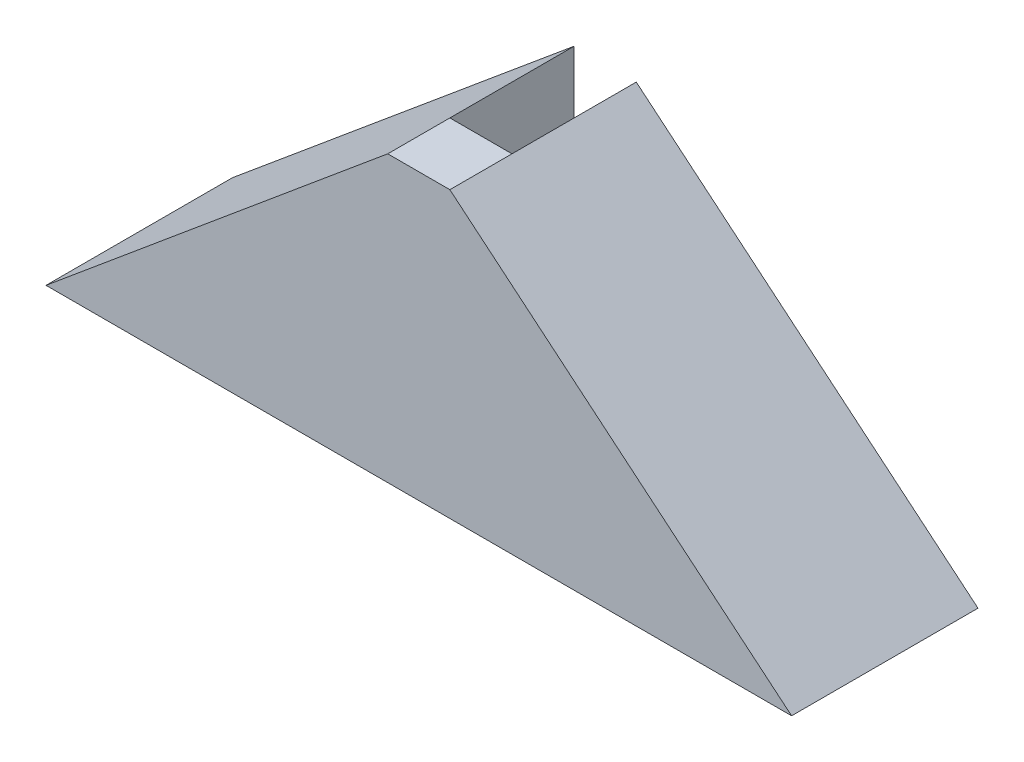
ISO-10303-21;
HEADER;
FILE_DESCRIPTION(('STEP AP214'),'2;1');
FILE_NAME('part.step','',(''),(''),'','','');
FILE_SCHEMA(('AUTOMOTIVE_DESIGN { 1 0 10303 214 1 1 1 1 }'));
ENDSEC;
DATA;
#1=APPLICATION_CONTEXT('core data for automotive mechanical design processes');
#2=APPLICATION_PROTOCOL_DEFINITION('international standard','automotive_design',2000,#1);
#3=PRODUCT_CONTEXT('',#1,'mechanical');
#4=PRODUCT('Part','Part','',(#3));
#5=PRODUCT_RELATED_PRODUCT_CATEGORY('part','',(#4));
#6=PRODUCT_DEFINITION_FORMATION('','',#4);
#7=PRODUCT_DEFINITION_CONTEXT('part definition',#1,'design');
#8=PRODUCT_DEFINITION('design','',#6,#7);
#9=PRODUCT_DEFINITION_SHAPE('','',#8);
#10=(LENGTH_UNIT() NAMED_UNIT(*) SI_UNIT(.MILLI.,.METRE.));
#11=(NAMED_UNIT(*) PLANE_ANGLE_UNIT() SI_UNIT($,.RADIAN.));
#12=(NAMED_UNIT(*) SI_UNIT($,.STERADIAN.) SOLID_ANGLE_UNIT());
#13=UNCERTAINTY_MEASURE_WITH_UNIT(LENGTH_MEASURE(1.E-05),#10,'distance_accuracy_value','');
#14=(GEOMETRIC_REPRESENTATION_CONTEXT(3) GLOBAL_UNCERTAINTY_ASSIGNED_CONTEXT((#13)) GLOBAL_UNIT_ASSIGNED_CONTEXT((#10,
#11,#12)) REPRESENTATION_CONTEXT('',''));
#15=CARTESIAN_POINT('',(0.,0.,0.));
#16=DIRECTION('',(0.,0.,1.));
#17=DIRECTION('',(1.,0.,0.));
#18=AXIS2_PLACEMENT_3D('',#15,#16,#17);
#19=CARTESIAN_POINT('',(0.,0.,0.));
#20=DIRECTION('',(0.,0.,1.));
#21=DIRECTION('',(1.,0.,0.));
#22=AXIS2_PLACEMENT_3D('',#19,#20,#21);
#23=PLANE('',#22);
#24=DIRECTION('',(-0.768221279597376,-0.64018439966448,0.));
#25=VECTOR('',#24,1.);
#26=CARTESIAN_POINT('',(-15.24,12.7,0.));
#27=LINE('',#26,#25);
#28=CARTESIAN_POINT('',(-16.51,11.6416666666667,0.));
#29=VERTEX_POINT('',#28);
#30=CARTESIAN_POINT('',(-30.48,0.,0.));
#31=VERTEX_POINT('',#30);
#32=EDGE_CURVE('E90',#29,#31,#27,.T.);
#33=ORIENTED_EDGE('',*,*,#32,.F.);
#34=DIRECTION('',(0.,1.,0.));
#35=VECTOR('',#34,1.);
#36=CARTESIAN_POINT('',(-16.51,0.,0.));
#37=LINE('',#36,#35);
#38=CARTESIAN_POINT('',(-16.51,0.,0.));
#39=VERTEX_POINT('',#38);
#40=EDGE_CURVE('E125',#39,#29,#37,.T.);
#41=ORIENTED_EDGE('',*,*,#40,.F.);
#42=DIRECTION('',(-1.,0.,0.));
#43=VECTOR('',#42,1.);
#44=CARTESIAN_POINT('',(0.,0.,0.));
#45=LINE('',#44,#43);
#46=EDGE_CURVE('E100',#39,#31,#45,.T.);
#47=ORIENTED_EDGE('',*,*,#46,.T.);
#48=EDGE_LOOP('',(#33,#41,#47));
#49=FACE_BOUND('',#48,.T.);
#50=ADVANCED_FACE('F39',(#49),#23,.F.);
#51=CARTESIAN_POINT('',(0.,0.,7.62));
#52=DIRECTION('',(-0.64018439966448,-0.768221279597376,0.));
#53=DIRECTION('',(0.768221279597376,-0.64018439966448,0.));
#54=AXIS2_PLACEMENT_3D('',#51,#52,#53);
#55=PLANE('',#54);
#56=DIRECTION('',(0.,0.,1.));
#57=VECTOR('',#56,1.);
#58=CARTESIAN_POINT('',(-13.97,11.6416666666667,7.62));
#59=LINE('',#58,#57);
#60=CARTESIAN_POINT('',(-13.97,11.6416666666667,0.));
#61=VERTEX_POINT('',#60);
#62=CARTESIAN_POINT('',(-13.97,11.6416666666667,5.08));
#63=VERTEX_POINT('',#62);
#64=EDGE_CURVE('E55',#61,#63,#59,.T.);
#65=ORIENTED_EDGE('',*,*,#64,.T.);
#66=DIRECTION('',(0.,0.,-1.));
#67=VECTOR('',#66,1.);
#68=CARTESIAN_POINT('',(-13.97,11.6416666666667,7.62));
#69=LINE('',#68,#67);
#70=CARTESIAN_POINT('',(-13.97,11.6416666666667,7.62));
#71=VERTEX_POINT('',#70);
#72=EDGE_CURVE('E170',#71,#63,#69,.T.);
#73=ORIENTED_EDGE('',*,*,#72,.F.);
#74=DIRECTION('',(-0.768221279597376,0.64018439966448,0.));
#75=VECTOR('',#74,1.);
#76=CARTESIAN_POINT('',(0.,0.,7.62));
#77=LINE('',#76,#75);
#78=CARTESIAN_POINT('',(0.,0.,7.62));
#79=VERTEX_POINT('',#78);
#80=EDGE_CURVE('E79',#79,#71,#77,.T.);
#81=ORIENTED_EDGE('',*,*,#80,.F.);
#82=DIRECTION('',(0.,0.,-1.));
#83=VECTOR('',#82,1.);
#84=CARTESIAN_POINT('',(0.,0.,7.62));
#85=LINE('',#84,#83);
#86=CARTESIAN_POINT('',(0.,0.,0.));
#87=VERTEX_POINT('',#86);
#88=EDGE_CURVE('E63',#79,#87,#85,.T.);
#89=ORIENTED_EDGE('',*,*,#88,.T.);
#90=DIRECTION('',(-0.768221279597376,0.64018439966448,0.));
#91=VECTOR('',#90,1.);
#92=CARTESIAN_POINT('',(0.,0.,0.));
#93=LINE('',#92,#91);
#94=EDGE_CURVE('E76',#87,#61,#93,.T.);
#95=ORIENTED_EDGE('',*,*,#94,.T.);
#96=EDGE_LOOP('',(#65,#73,#81,#89,#95));
#97=FACE_BOUND('',#96,.T.);
#98=ADVANCED_FACE('F41',(#97),#55,.F.);
#99=CARTESIAN_POINT('',(-15.24,12.7,7.62));
#100=DIRECTION('',(0.64018439966448,-0.768221279597376,0.));
#101=DIRECTION('',(0.768221279597376,0.64018439966448,0.));
#102=AXIS2_PLACEMENT_3D('',#99,#100,#101);
#103=PLANE('',#102);
#104=DIRECTION('',(-0.768221279597376,-0.64018439966448,0.));
#105=VECTOR('',#104,1.);
#106=CARTESIAN_POINT('',(-15.24,12.7,7.62));
#107=LINE('',#106,#105);
#108=CARTESIAN_POINT('',(-16.51,11.6416666666667,7.62));
#109=VERTEX_POINT('',#108);
#110=CARTESIAN_POINT('',(-30.48,0.,7.62));
#111=VERTEX_POINT('',#110);
#112=EDGE_CURVE('E104',#109,#111,#107,.T.);
#113=ORIENTED_EDGE('',*,*,#112,.F.);
#114=DIRECTION('',(0.,0.,-1.));
#115=VECTOR('',#114,1.);
#116=CARTESIAN_POINT('',(-16.51,11.6416666666667,7.62));
#117=LINE('',#116,#115);
#118=CARTESIAN_POINT('',(-16.51,11.6416666666667,5.08));
#119=VERTEX_POINT('',#118);
#120=EDGE_CURVE('E140',#109,#119,#117,.T.);
#121=ORIENTED_EDGE('',*,*,#120,.T.);
#122=DIRECTION('',(0.,0.,-1.));
#123=VECTOR('',#122,1.);
#124=CARTESIAN_POINT('',(-16.51,11.6416666666667,7.62));
#125=LINE('',#124,#123);
#126=EDGE_CURVE('E91',#119,#29,#125,.T.);
#127=ORIENTED_EDGE('',*,*,#126,.T.);
#128=ORIENTED_EDGE('',*,*,#32,.T.);
#129=DIRECTION('',(0.,0.,-1.));
#130=VECTOR('',#129,1.);
#131=CARTESIAN_POINT('',(-30.48,0.,7.62));
#132=LINE('',#131,#130);
#133=EDGE_CURVE('E48',#111,#31,#132,.T.);
#134=ORIENTED_EDGE('',*,*,#133,.F.);
#135=EDGE_LOOP('',(#113,#121,#127,#128,#134));
#136=FACE_BOUND('',#135,.T.);
#137=ADVANCED_FACE('F115',(#136),#103,.F.);
#138=CARTESIAN_POINT('',(0.,0.,7.62));
#139=DIRECTION('',(0.,-1.,0.));
#140=DIRECTION('',(1.,0.,0.));
#141=AXIS2_PLACEMENT_3D('',#138,#139,#140);
#142=PLANE('',#141);
#143=DIRECTION('',(0.,0.,-1.));
#144=VECTOR('',#143,1.);
#145=CARTESIAN_POINT('',(-16.51,0.,5.08));
#146=LINE('',#145,#144);
#147=CARTESIAN_POINT('',(-16.51,0.,5.08));
#148=VERTEX_POINT('',#147);
#149=EDGE_CURVE('E146',#148,#39,#146,.T.);
#150=ORIENTED_EDGE('',*,*,#149,.F.);
#151=DIRECTION('',(-1.,0.,0.));
#152=VECTOR('',#151,1.);
#153=CARTESIAN_POINT('',(-16.51,0.,5.08));
#154=LINE('',#153,#152);
#155=CARTESIAN_POINT('',(-13.97,0.,5.08));
#156=VERTEX_POINT('',#155);
#157=EDGE_CURVE('E144',#156,#148,#154,.T.);
#158=ORIENTED_EDGE('',*,*,#157,.F.);
#159=DIRECTION('',(0.,0.,-1.));
#160=VECTOR('',#159,1.);
#161=CARTESIAN_POINT('',(-13.97,0.,5.08));
#162=LINE('',#161,#160);
#163=CARTESIAN_POINT('',(-13.97,0.,0.));
#164=VERTEX_POINT('',#163);
#165=EDGE_CURVE('E98',#156,#164,#162,.T.);
#166=ORIENTED_EDGE('',*,*,#165,.T.);
#167=EDGE_CURVE('E88',#87,#164,#45,.T.);
#168=ORIENTED_EDGE('',*,*,#167,.F.);
#169=ORIENTED_EDGE('',*,*,#88,.F.);
#170=DIRECTION('',(-1.,0.,0.));
#171=VECTOR('',#170,1.);
#172=CARTESIAN_POINT('',(0.,0.,7.62));
#173=LINE('',#172,#171);
#174=EDGE_CURVE('E82',#79,#111,#173,.T.);
#175=ORIENTED_EDGE('',*,*,#174,.T.);
#176=ORIENTED_EDGE('',*,*,#133,.T.);
#177=ORIENTED_EDGE('',*,*,#46,.F.);
#178=EDGE_LOOP('',(#150,#158,#166,#168,#169,#175,#176,#177));
#179=FACE_BOUND('',#178,.T.);
#180=ADVANCED_FACE('F95',(#179),#142,.T.);
#181=CARTESIAN_POINT('',(0.,0.,7.62));
#182=DIRECTION('',(0.,0.,1.));
#183=DIRECTION('',(1.,0.,0.));
#184=AXIS2_PLACEMENT_3D('',#181,#182,#183);
#185=PLANE('',#184);
#186=DIRECTION('',(-1.,0.,0.));
#187=VECTOR('',#186,1.);
#188=CARTESIAN_POINT('',(-13.97,11.6416666666667,7.62));
#189=LINE('',#188,#187);
#190=EDGE_CURVE('E162',#71,#109,#189,.T.);
#191=ORIENTED_EDGE('',*,*,#190,.T.);
#192=ORIENTED_EDGE('',*,*,#112,.T.);
#193=ORIENTED_EDGE('',*,*,#174,.F.);
#194=ORIENTED_EDGE('',*,*,#80,.T.);
#195=EDGE_LOOP('',(#191,#192,#193,#194));
#196=FACE_BOUND('',#195,.T.);
#197=ADVANCED_FACE('F160',(#196),#185,.T.);
#198=ORIENTED_EDGE('',*,*,#167,.T.);
#199=DIRECTION('',(0.,1.,0.));
#200=VECTOR('',#199,1.);
#201=CARTESIAN_POINT('',(-13.97,0.,0.));
#202=LINE('',#201,#200);
#203=EDGE_CURVE('E11',#164,#61,#202,.T.);
#204=ORIENTED_EDGE('',*,*,#203,.T.);
#205=ORIENTED_EDGE('',*,*,#94,.F.);
#206=EDGE_LOOP('',(#198,#204,#205));
#207=FACE_BOUND('',#206,.T.);
#208=ADVANCED_FACE('F86',(#207),#23,.F.);
#209=CARTESIAN_POINT('',(0.,0.,5.08));
#210=DIRECTION('',(0.,0.,-1.));
#211=DIRECTION('',(-1.,0.,0.));
#212=AXIS2_PLACEMENT_3D('',#209,#210,#211);
#213=PLANE('',#212);
#214=DIRECTION('',(-1.,0.,0.));
#215=VECTOR('',#214,1.);
#216=CARTESIAN_POINT('',(0.,11.6416666666667,5.08));
#217=LINE('',#216,#215);
#218=EDGE_CURVE('E132',#63,#119,#217,.T.);
#219=ORIENTED_EDGE('',*,*,#218,.F.);
#220=DIRECTION('',(0.,-1.,0.));
#221=VECTOR('',#220,1.);
#222=CARTESIAN_POINT('',(-13.97,0.,5.08));
#223=LINE('',#222,#221);
#224=EDGE_CURVE('E137',#63,#156,#223,.T.);
#225=ORIENTED_EDGE('',*,*,#224,.T.);
#226=ORIENTED_EDGE('',*,*,#157,.T.);
#227=DIRECTION('',(0.,1.,0.));
#228=VECTOR('',#227,1.);
#229=CARTESIAN_POINT('',(-16.51,0.,5.08));
#230=LINE('',#229,#228);
#231=EDGE_CURVE('E131',#148,#119,#230,.T.);
#232=ORIENTED_EDGE('',*,*,#231,.T.);
#233=EDGE_LOOP('',(#219,#225,#226,#232));
#234=FACE_BOUND('',#233,.T.);
#235=ADVANCED_FACE('F183',(#234),#213,.T.);
#236=CARTESIAN_POINT('',(-16.51,0.,5.08));
#237=DIRECTION('',(-1.,0.,0.));
#238=DIRECTION('',(0.,-1.,0.));
#239=AXIS2_PLACEMENT_3D('',#236,#237,#238);
#240=PLANE('',#239);
#241=ORIENTED_EDGE('',*,*,#231,.F.);
#242=ORIENTED_EDGE('',*,*,#149,.T.);
#243=ORIENTED_EDGE('',*,*,#40,.T.);
#244=ORIENTED_EDGE('',*,*,#126,.F.);
#245=EDGE_LOOP('',(#241,#242,#243,#244));
#246=FACE_BOUND('',#245,.T.);
#247=ADVANCED_FACE('F187',(#246),#240,.F.);
#248=CARTESIAN_POINT('',(-13.97,0.,5.08));
#249=DIRECTION('',(1.,0.,0.));
#250=DIRECTION('',(0.,0.,-1.));
#251=AXIS2_PLACEMENT_3D('',#248,#249,#250);
#252=PLANE('',#251);
#253=ORIENTED_EDGE('',*,*,#203,.F.);
#254=ORIENTED_EDGE('',*,*,#165,.F.);
#255=ORIENTED_EDGE('',*,*,#224,.F.);
#256=ORIENTED_EDGE('',*,*,#64,.F.);
#257=EDGE_LOOP('',(#253,#254,#255,#256));
#258=FACE_BOUND('',#257,.T.);
#259=ADVANCED_FACE('F194',(#258),#252,.F.);
#260=CARTESIAN_POINT('',(-13.97,11.6416666666667,7.62));
#261=DIRECTION('',(0.,-1.,0.));
#262=DIRECTION('',(0.,0.,-1.));
#263=AXIS2_PLACEMENT_3D('',#260,#261,#262);
#264=PLANE('',#263);
#265=ORIENTED_EDGE('',*,*,#218,.T.);
#266=ORIENTED_EDGE('',*,*,#120,.F.);
#267=ORIENTED_EDGE('',*,*,#190,.F.);
#268=ORIENTED_EDGE('',*,*,#72,.T.);
#269=EDGE_LOOP('',(#265,#266,#267,#268));
#270=FACE_BOUND('',#269,.T.);
#271=ADVANCED_FACE('F193',(#270),#264,.F.);
#272=CLOSED_SHELL('',(#50,#98,#137,#180,#197,#208,#235,#247,#259,#271));
#273=MANIFOLD_SOLID_BREP('B2',#272);
#274=ADVANCED_BREP_SHAPE_REPRESENTATION('',(#18,#273),#14);
#275=SHAPE_DEFINITION_REPRESENTATION(#9,#274);
ENDSEC;
END-ISO-10303-21;
